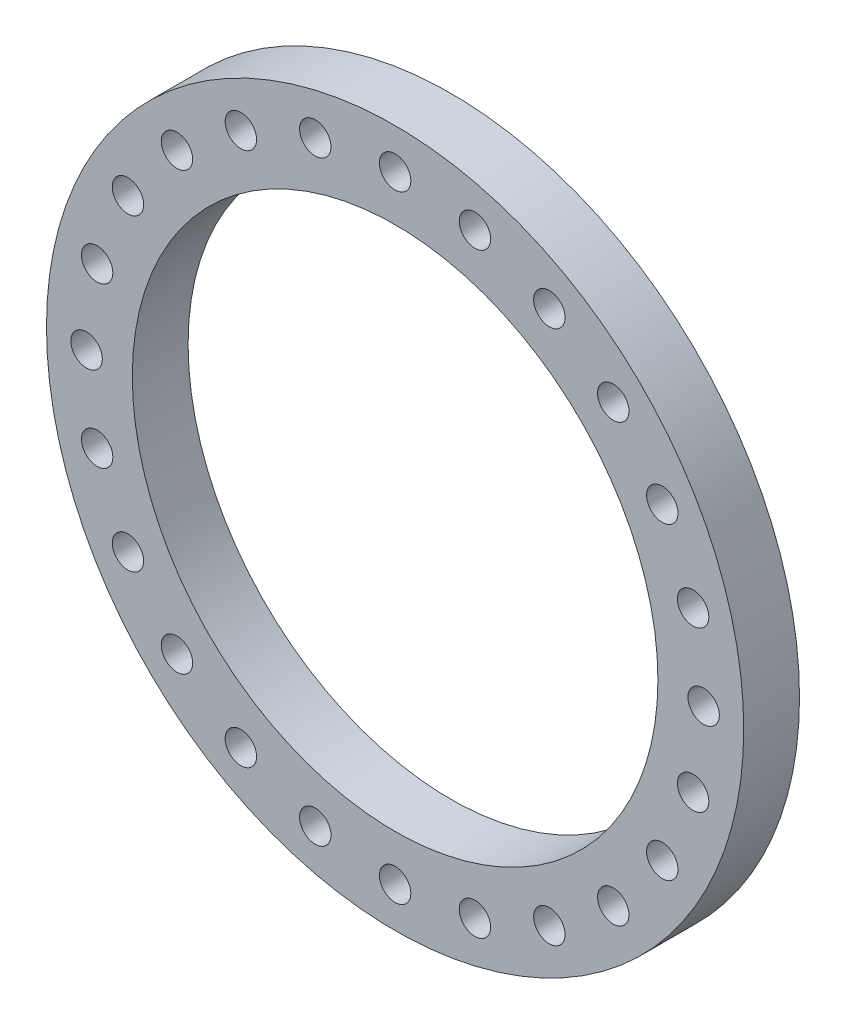
ISO-10303-21;
HEADER;
FILE_DESCRIPTION(('STEP AP214'),'2;1');
FILE_NAME('part.step','',(''),(''),'','','');
FILE_SCHEMA(('AUTOMOTIVE_DESIGN { 1 0 10303 214 1 1 1 1 }'));
ENDSEC;
DATA;
#1=APPLICATION_CONTEXT('core data for automotive mechanical design processes');
#2=APPLICATION_PROTOCOL_DEFINITION('international standard','automotive_design',2000,#1);
#3=PRODUCT_CONTEXT('',#1,'mechanical');
#4=PRODUCT('Part','Part','',(#3));
#5=PRODUCT_RELATED_PRODUCT_CATEGORY('part','',(#4));
#6=PRODUCT_DEFINITION_FORMATION('','',#4);
#7=PRODUCT_DEFINITION_CONTEXT('part definition',#1,'design');
#8=PRODUCT_DEFINITION('design','',#6,#7);
#9=PRODUCT_DEFINITION_SHAPE('','',#8);
#10=(LENGTH_UNIT() NAMED_UNIT(*) SI_UNIT(.MILLI.,.METRE.));
#11=(NAMED_UNIT(*) PLANE_ANGLE_UNIT() SI_UNIT($,.RADIAN.));
#12=(NAMED_UNIT(*) SI_UNIT($,.STERADIAN.) SOLID_ANGLE_UNIT());
#13=UNCERTAINTY_MEASURE_WITH_UNIT(LENGTH_MEASURE(1.E-05),#10,'distance_accuracy_value','');
#14=(GEOMETRIC_REPRESENTATION_CONTEXT(3) GLOBAL_UNCERTAINTY_ASSIGNED_CONTEXT((#13)) GLOBAL_UNIT_ASSIGNED_CONTEXT((#10,
#11,#12)) REPRESENTATION_CONTEXT('',''));
#15=CARTESIAN_POINT('',(0.,0.,0.));
#16=DIRECTION('',(0.,0.,1.));
#17=DIRECTION('',(1.,0.,0.));
#18=AXIS2_PLACEMENT_3D('',#15,#16,#17);
#19=CARTESIAN_POINT('',(0.,0.,62.));
#20=DIRECTION('',(0.,0.,-1.));
#21=DIRECTION('',(-1.,0.,0.));
#22=AXIS2_PLACEMENT_3D('',#19,#20,#21);
#23=CYLINDRICAL_SURFACE('',#22,387.5);
#24=CARTESIAN_POINT('',(0.,0.,62.));
#25=DIRECTION('',(0.,0.,1.));
#26=DIRECTION('',(1.,0.,0.));
#27=AXIS2_PLACEMENT_3D('',#24,#25,#26);
#28=CIRCLE('',#27,387.5);
#29=CARTESIAN_POINT('',(387.5,0.,62.));
#30=VERTEX_POINT('',#29);
#31=EDGE_CURVE('E10',#30,#30,#28,.T.);
#32=ORIENTED_EDGE('',*,*,#31,.F.);
#33=EDGE_LOOP('',(#32));
#34=FACE_BOUND('',#33,.T.);
#35=CARTESIAN_POINT('',(0.,0.,0.));
#36=DIRECTION('',(0.,0.,1.));
#37=DIRECTION('',(1.,0.,0.));
#38=AXIS2_PLACEMENT_3D('',#35,#36,#37);
#39=CIRCLE('',#38,387.5);
#40=CARTESIAN_POINT('',(387.5,0.,0.));
#41=VERTEX_POINT('',#40);
#42=EDGE_CURVE('E40',#41,#41,#39,.T.);
#43=ORIENTED_EDGE('',*,*,#42,.T.);
#44=EDGE_LOOP('',(#43));
#45=FACE_BOUND('',#44,.T.);
#46=ADVANCED_FACE('F37',(#34,#45),#23,.T.);
#47=CARTESIAN_POINT('',(0.,0.,62.));
#48=DIRECTION('',(0.,0.,1.));
#49=DIRECTION('',(1.,0.,0.));
#50=AXIS2_PLACEMENT_3D('',#47,#48,#49);
#51=PLANE('',#50);
#52=CARTESIAN_POINT('',(331.215965834522,-88.7490505656511,62.));
#53=DIRECTION('',(0.,0.,1.));
#54=DIRECTION('',(1.,0.,0.));
#55=AXIS2_PLACEMENT_3D('',#52,#53,#54);
#56=CIRCLE('',#55,17.4625);
#57=CARTESIAN_POINT('',(348.678465834522,-88.7490505656511,62.));
#58=VERTEX_POINT('',#57);
#59=EDGE_CURVE('E54',#58,#58,#56,.T.);
#60=ORIENTED_EDGE('',*,*,#59,.F.);
#61=EDGE_LOOP('',(#60));
#62=FACE_BOUND('',#61,.T.);
#63=CARTESIAN_POINT('',(296.960110957686,-171.449999999997,62.));
#64=DIRECTION('',(0.,0.,1.));
#65=DIRECTION('',(1.,0.,0.));
#66=AXIS2_PLACEMENT_3D('',#63,#64,#65);
#67=CIRCLE('',#66,17.4625);
#68=CARTESIAN_POINT('',(314.422610957686,-171.449999999997,62.));
#69=VERTEX_POINT('',#68);
#70=EDGE_CURVE('E57',#69,#69,#67,.T.);
#71=ORIENTED_EDGE('',*,*,#70,.F.);
#72=EDGE_LOOP('',(#71));
#73=FACE_BOUND('',#72,.T.);
#74=CARTESIAN_POINT('',(242.466915268869,-242.466915268865,62.));
#75=DIRECTION('',(0.,0.,1.));
#76=DIRECTION('',(1.,0.,0.));
#77=AXIS2_PLACEMENT_3D('',#74,#75,#76);
#78=CIRCLE('',#77,17.4625);
#79=CARTESIAN_POINT('',(259.929415268869,-242.466915268865,62.));
#80=VERTEX_POINT('',#79);
#81=EDGE_CURVE('E60',#80,#80,#78,.T.);
#82=ORIENTED_EDGE('',*,*,#81,.F.);
#83=EDGE_LOOP('',(#82));
#84=FACE_BOUND('',#83,.T.);
#85=CARTESIAN_POINT('',(171.450000000002,-296.960110957683,62.));
#86=DIRECTION('',(0.,0.,1.));
#87=DIRECTION('',(1.,0.,0.));
#88=AXIS2_PLACEMENT_3D('',#85,#86,#87);
#89=CIRCLE('',#88,17.4625);
#90=CARTESIAN_POINT('',(188.912500000002,-296.960110957683,62.));
#91=VERTEX_POINT('',#90);
#92=EDGE_CURVE('E63',#91,#91,#89,.T.);
#93=ORIENTED_EDGE('',*,*,#92,.F.);
#94=EDGE_LOOP('',(#93));
#95=FACE_BOUND('',#94,.T.);
#96=CARTESIAN_POINT('',(88.7490505656569,-331.215965834521,62.));
#97=DIRECTION('',(0.,0.,1.));
#98=DIRECTION('',(1.,0.,0.));
#99=AXIS2_PLACEMENT_3D('',#96,#97,#98);
#100=CIRCLE('',#99,17.4625);
#101=CARTESIAN_POINT('',(106.211550565657,-331.215965834521,62.));
#102=VERTEX_POINT('',#101);
#103=EDGE_CURVE('E66',#102,#102,#100,.T.);
#104=ORIENTED_EDGE('',*,*,#103,.F.);
#105=EDGE_LOOP('',(#104));
#106=FACE_BOUND('',#105,.T.);
#107=CARTESIAN_POINT('',(0.,-342.9,62.));
#108=DIRECTION('',(0.,0.,1.));
#109=DIRECTION('',(1.,0.,0.));
#110=AXIS2_PLACEMENT_3D('',#107,#108,#109);
#111=CIRCLE('',#110,17.4625);
#112=CARTESIAN_POINT('',(17.4625,-342.9,62.));
#113=VERTEX_POINT('',#112);
#114=EDGE_CURVE('E69',#113,#113,#111,.T.);
#115=ORIENTED_EDGE('',*,*,#114,.F.);
#116=EDGE_LOOP('',(#115));
#117=FACE_BOUND('',#116,.T.);
#118=CARTESIAN_POINT('',(-88.7490505656522,-331.215965834522,62.));
#119=DIRECTION('',(0.,0.,1.));
#120=DIRECTION('',(1.,0.,0.));
#121=AXIS2_PLACEMENT_3D('',#118,#119,#120);
#122=CIRCLE('',#121,17.4625);
#123=CARTESIAN_POINT('',(-71.2865505656522,-331.215965834522,62.));
#124=VERTEX_POINT('',#123);
#125=EDGE_CURVE('E72',#124,#124,#122,.T.);
#126=ORIENTED_EDGE('',*,*,#125,.F.);
#127=EDGE_LOOP('',(#126));
#128=FACE_BOUND('',#127,.T.);
#129=CARTESIAN_POINT('',(-171.449999999998,-296.960110957685,62.));
#130=DIRECTION('',(0.,0.,1.));
#131=DIRECTION('',(1.,0.,0.));
#132=AXIS2_PLACEMENT_3D('',#129,#130,#131);
#133=CIRCLE('',#132,17.4625);
#134=CARTESIAN_POINT('',(-153.987499999998,-296.960110957685,62.));
#135=VERTEX_POINT('',#134);
#136=EDGE_CURVE('E75',#135,#135,#133,.T.);
#137=ORIENTED_EDGE('',*,*,#136,.F.);
#138=EDGE_LOOP('',(#137));
#139=FACE_BOUND('',#138,.T.);
#140=CARTESIAN_POINT('',(-242.466915268866,-242.466915268868,62.));
#141=DIRECTION('',(0.,0.,1.));
#142=DIRECTION('',(1.,0.,0.));
#143=AXIS2_PLACEMENT_3D('',#140,#141,#142);
#144=CIRCLE('',#143,17.4625);
#145=CARTESIAN_POINT('',(-225.004415268866,-242.466915268868,62.));
#146=VERTEX_POINT('',#145);
#147=EDGE_CURVE('E78',#146,#146,#144,.T.);
#148=ORIENTED_EDGE('',*,*,#147,.F.);
#149=EDGE_LOOP('',(#148));
#150=FACE_BOUND('',#149,.T.);
#151=CARTESIAN_POINT('',(-296.960110957683,-171.450000000001,62.));
#152=DIRECTION('',(0.,0.,1.));
#153=DIRECTION('',(1.,0.,0.));
#154=AXIS2_PLACEMENT_3D('',#151,#152,#153);
#155=CIRCLE('',#154,17.4625);
#156=CARTESIAN_POINT('',(-279.497610957683,-171.450000000001,62.));
#157=VERTEX_POINT('',#156);
#158=EDGE_CURVE('E81',#157,#157,#155,.T.);
#159=ORIENTED_EDGE('',*,*,#158,.F.);
#160=EDGE_LOOP('',(#159));
#161=FACE_BOUND('',#160,.T.);
#162=CARTESIAN_POINT('',(-331.215965834521,-88.7490505656557,62.));
#163=DIRECTION('',(0.,0.,1.));
#164=DIRECTION('',(1.,0.,0.));
#165=AXIS2_PLACEMENT_3D('',#162,#163,#164);
#166=CIRCLE('',#165,17.4625);
#167=CARTESIAN_POINT('',(-313.753465834521,-88.7490505656557,62.));
#168=VERTEX_POINT('',#167);
#169=EDGE_CURVE('E84',#168,#168,#166,.T.);
#170=ORIENTED_EDGE('',*,*,#169,.F.);
#171=EDGE_LOOP('',(#170));
#172=FACE_BOUND('',#171,.T.);
#173=CARTESIAN_POINT('',(-342.9,-1.19722895108931E-12,62.));
#174=DIRECTION('',(0.,0.,1.));
#175=DIRECTION('',(1.,0.,0.));
#176=AXIS2_PLACEMENT_3D('',#173,#174,#175);
#177=CIRCLE('',#176,17.4625);
#178=CARTESIAN_POINT('',(-325.4375,-1.19722895108931E-12,62.));
#179=VERTEX_POINT('',#178);
#180=EDGE_CURVE('E87',#179,#179,#177,.T.);
#181=ORIENTED_EDGE('',*,*,#180,.F.);
#182=EDGE_LOOP('',(#181));
#183=FACE_BOUND('',#182,.T.);
#184=CARTESIAN_POINT('',(-331.215965834522,88.7490505656534,62.));
#185=DIRECTION('',(0.,0.,1.));
#186=DIRECTION('',(1.,0.,0.));
#187=AXIS2_PLACEMENT_3D('',#184,#185,#186);
#188=CIRCLE('',#187,17.4625);
#189=CARTESIAN_POINT('',(-313.753465834522,88.7490505656534,62.));
#190=VERTEX_POINT('',#189);
#191=EDGE_CURVE('E90',#190,#190,#188,.T.);
#192=ORIENTED_EDGE('',*,*,#191,.F.);
#193=EDGE_LOOP('',(#192));
#194=FACE_BOUND('',#193,.T.);
#195=CARTESIAN_POINT('',(-296.960110957684,171.449999999999,62.));
#196=DIRECTION('',(0.,0.,1.));
#197=DIRECTION('',(1.,0.,0.));
#198=AXIS2_PLACEMENT_3D('',#195,#196,#197);
#199=CIRCLE('',#198,17.4625);
#200=CARTESIAN_POINT('',(-279.497610957684,171.449999999999,62.));
#201=VERTEX_POINT('',#200);
#202=EDGE_CURVE('E93',#201,#201,#199,.T.);
#203=ORIENTED_EDGE('',*,*,#202,.F.);
#204=EDGE_LOOP('',(#203));
#205=FACE_BOUND('',#204,.T.);
#206=CARTESIAN_POINT('',(-242.466915268868,242.466915268867,62.));
#207=DIRECTION('',(0.,0.,1.));
#208=DIRECTION('',(1.,0.,0.));
#209=AXIS2_PLACEMENT_3D('',#206,#207,#208);
#210=CIRCLE('',#209,17.4625);
#211=CARTESIAN_POINT('',(-225.004415268868,242.466915268867,62.));
#212=VERTEX_POINT('',#211);
#213=EDGE_CURVE('E96',#212,#212,#210,.T.);
#214=ORIENTED_EDGE('',*,*,#213,.F.);
#215=EDGE_LOOP('',(#214));
#216=FACE_BOUND('',#215,.T.);
#217=CARTESIAN_POINT('',(-171.45,296.960110957684,62.));
#218=DIRECTION('',(0.,0.,1.));
#219=DIRECTION('',(1.,0.,0.));
#220=AXIS2_PLACEMENT_3D('',#217,#218,#219);
#221=CIRCLE('',#220,17.4625);
#222=CARTESIAN_POINT('',(-153.9875,296.960110957684,62.));
#223=VERTEX_POINT('',#222);
#224=EDGE_CURVE('E99',#223,#223,#221,.T.);
#225=ORIENTED_EDGE('',*,*,#224,.F.);
#226=EDGE_LOOP('',(#225));
#227=FACE_BOUND('',#226,.T.);
#228=CARTESIAN_POINT('',(342.9,3.59168685326793E-12,62.));
#229=DIRECTION('',(0.,0.,1.));
#230=DIRECTION('',(1.,0.,0.));
#231=AXIS2_PLACEMENT_3D('',#228,#229,#230);
#232=CIRCLE('',#231,17.4625);
#233=CARTESIAN_POINT('',(360.3625,3.59168685326793E-12,62.));
#234=VERTEX_POINT('',#233);
#235=EDGE_CURVE('E102',#234,#234,#232,.T.);
#236=ORIENTED_EDGE('',*,*,#235,.F.);
#237=EDGE_LOOP('',(#236));
#238=FACE_BOUND('',#237,.T.);
#239=CARTESIAN_POINT('',(331.21596583452,88.749050565658,62.));
#240=DIRECTION('',(0.,0.,1.));
#241=DIRECTION('',(1.,0.,0.));
#242=AXIS2_PLACEMENT_3D('',#239,#240,#241);
#243=CIRCLE('',#242,17.4625);
#244=CARTESIAN_POINT('',(348.678465834521,88.749050565658,62.));
#245=VERTEX_POINT('',#244);
#246=EDGE_CURVE('E105',#245,#245,#243,.T.);
#247=ORIENTED_EDGE('',*,*,#246,.F.);
#248=EDGE_LOOP('',(#247));
#249=FACE_BOUND('',#248,.T.);
#250=CARTESIAN_POINT('',(296.960110957682,171.450000000003,62.));
#251=DIRECTION('',(0.,0.,1.));
#252=DIRECTION('',(1.,0.,0.));
#253=AXIS2_PLACEMENT_3D('',#250,#251,#252);
#254=CIRCLE('',#253,17.4625);
#255=CARTESIAN_POINT('',(314.422610957682,171.450000000003,62.));
#256=VERTEX_POINT('',#255);
#257=EDGE_CURVE('E108',#256,#256,#254,.T.);
#258=ORIENTED_EDGE('',*,*,#257,.F.);
#259=EDGE_LOOP('',(#258));
#260=FACE_BOUND('',#259,.T.);
#261=CARTESIAN_POINT('',(242.466915268864,242.46691526887,62.));
#262=DIRECTION('',(0.,0.,1.));
#263=DIRECTION('',(1.,0.,0.));
#264=AXIS2_PLACEMENT_3D('',#261,#262,#263);
#265=CIRCLE('',#264,17.4625);
#266=CARTESIAN_POINT('',(259.929415268864,242.46691526887,62.));
#267=VERTEX_POINT('',#266);
#268=EDGE_CURVE('E111',#267,#267,#265,.T.);
#269=ORIENTED_EDGE('',*,*,#268,.F.);
#270=EDGE_LOOP('',(#269));
#271=FACE_BOUND('',#270,.T.);
#272=CARTESIAN_POINT('',(171.449999999996,296.960110957686,62.));
#273=DIRECTION('',(0.,0.,1.));
#274=DIRECTION('',(1.,0.,0.));
#275=AXIS2_PLACEMENT_3D('',#272,#273,#274);
#276=CIRCLE('',#275,17.4625);
#277=CARTESIAN_POINT('',(188.912499999996,296.960110957686,62.));
#278=VERTEX_POINT('',#277);
#279=EDGE_CURVE('E114',#278,#278,#276,.T.);
#280=ORIENTED_EDGE('',*,*,#279,.F.);
#281=EDGE_LOOP('',(#280));
#282=FACE_BOUND('',#281,.T.);
#283=CARTESIAN_POINT('',(88.7490505656499,331.215965834523,62.));
#284=DIRECTION('',(0.,0.,1.));
#285=DIRECTION('',(1.,0.,0.));
#286=AXIS2_PLACEMENT_3D('',#283,#284,#285);
#287=CIRCLE('',#286,17.4625);
#288=CARTESIAN_POINT('',(106.21155056565,331.215965834523,62.));
#289=VERTEX_POINT('',#288);
#290=EDGE_CURVE('E117',#289,#289,#287,.T.);
#291=ORIENTED_EDGE('',*,*,#290,.F.);
#292=EDGE_LOOP('',(#291));
#293=FACE_BOUND('',#292,.T.);
#294=CARTESIAN_POINT('',(-88.7490505656546,331.215965834521,62.));
#295=DIRECTION('',(0.,0.,1.));
#296=DIRECTION('',(1.,0.,0.));
#297=AXIS2_PLACEMENT_3D('',#294,#295,#296);
#298=CIRCLE('',#297,17.4625);
#299=CARTESIAN_POINT('',(-71.2865505656546,331.215965834521,62.));
#300=VERTEX_POINT('',#299);
#301=EDGE_CURVE('E120',#300,#300,#298,.T.);
#302=ORIENTED_EDGE('',*,*,#301,.F.);
#303=EDGE_LOOP('',(#302));
#304=FACE_BOUND('',#303,.T.);
#305=CARTESIAN_POINT('',(0.,0.,62.));
#306=DIRECTION('',(0.,0.,1.));
#307=DIRECTION('',(1.,0.,0.));
#308=AXIS2_PLACEMENT_3D('',#305,#306,#307);
#309=CIRCLE('',#308,292.1);
#310=CARTESIAN_POINT('',(292.1,0.,62.));
#311=VERTEX_POINT('',#310);
#312=EDGE_CURVE('E179',#311,#311,#309,.T.);
#313=ORIENTED_EDGE('',*,*,#312,.F.);
#314=EDGE_LOOP('',(#313));
#315=FACE_BOUND('',#314,.T.);
#316=CARTESIAN_POINT('',(0.,342.9,62.));
#317=DIRECTION('',(0.,0.,1.));
#318=DIRECTION('',(1.,0.,0.));
#319=AXIS2_PLACEMENT_3D('',#316,#317,#318);
#320=CIRCLE('',#319,17.4625);
#321=CARTESIAN_POINT('',(17.4625,342.9,62.));
#322=VERTEX_POINT('',#321);
#323=EDGE_CURVE('E47',#322,#322,#320,.T.);
#324=ORIENTED_EDGE('',*,*,#323,.F.);
#325=EDGE_LOOP('',(#324));
#326=FACE_BOUND('',#325,.T.);
#327=ORIENTED_EDGE('',*,*,#31,.T.);
#328=EDGE_LOOP('',(#327));
#329=FACE_BOUND('',#328,.T.);
#330=ADVANCED_FACE('F215',(#62,#73,#84,#95,#106,#117,#128,#139,#150,#161,#172,#183,#194,#205,
#216,#227,#238,#249,#260,#271,#282,#293,#304,#315,#326,#329),#51,.T.);
#331=CARTESIAN_POINT('',(0.,0.,0.));
#332=DIRECTION('',(0.,0.,1.));
#333=DIRECTION('',(1.,0.,0.));
#334=AXIS2_PLACEMENT_3D('',#331,#332,#333);
#335=PLANE('',#334);
#336=CARTESIAN_POINT('',(0.,0.,0.));
#337=DIRECTION('',(0.,0.,1.));
#338=DIRECTION('',(1.,0.,0.));
#339=AXIS2_PLACEMENT_3D('',#336,#337,#338);
#340=CIRCLE('',#339,292.1);
#341=CARTESIAN_POINT('',(292.1,0.,0.));
#342=VERTEX_POINT('',#341);
#343=EDGE_CURVE('E195',#342,#342,#340,.T.);
#344=ORIENTED_EDGE('',*,*,#343,.T.);
#345=EDGE_LOOP('',(#344));
#346=FACE_BOUND('',#345,.T.);
#347=CARTESIAN_POINT('',(331.215965834522,-88.7490505656511,0.));
#348=DIRECTION('',(0.,0.,1.));
#349=DIRECTION('',(-0.258819045102511,-0.965925826289071,0.));
#350=AXIS2_PLACEMENT_3D('',#347,#348,#349);
#351=CIRCLE('',#350,17.4625);
#352=CARTESIAN_POINT('',(326.69633825942,-105.616530307224,0.));
#353=VERTEX_POINT('',#352);
#354=EDGE_CURVE('E151',#353,#353,#351,.T.);
#355=ORIENTED_EDGE('',*,*,#354,.T.);
#356=EDGE_LOOP('',(#355));
#357=FACE_BOUND('',#356,.T.);
#358=CARTESIAN_POINT('',(296.960110957686,-171.449999999997,0.));
#359=DIRECTION('',(0.,0.,1.));
#360=DIRECTION('',(-0.499999999999992,-0.866025403784443,0.));
#361=AXIS2_PLACEMENT_3D('',#358,#359,#360);
#362=CIRCLE('',#361,17.4625);
#363=CARTESIAN_POINT('',(288.228860957686,-186.572968613583,0.));
#364=VERTEX_POINT('',#363);
#365=EDGE_CURVE('E154',#364,#364,#362,.T.);
#366=ORIENTED_EDGE('',*,*,#365,.T.);
#367=EDGE_LOOP('',(#366));
#368=FACE_BOUND('',#367,.T.);
#369=CARTESIAN_POINT('',(242.466915268869,-242.466915268865,0.));
#370=DIRECTION('',(0.,0.,1.));
#371=DIRECTION('',(-0.707106781186541,-0.707106781186554,0.));
#372=AXIS2_PLACEMENT_3D('',#369,#370,#371);
#373=CIRCLE('',#372,17.4625);
#374=CARTESIAN_POINT('',(230.119063102399,-254.814767435335,0.));
#375=VERTEX_POINT('',#374);
#376=EDGE_CURVE('E158',#375,#375,#373,.T.);
#377=ORIENTED_EDGE('',*,*,#376,.T.);
#378=EDGE_LOOP('',(#377));
#379=FACE_BOUND('',#378,.T.);
#380=CARTESIAN_POINT('',(171.450000000002,-296.960110957683,0.));
#381=DIRECTION('',(0.,0.,1.));
#382=DIRECTION('',(-0.866025403784435,-0.500000000000007,0.));
#383=AXIS2_PLACEMENT_3D('',#380,#381,#382);
#384=CIRCLE('',#383,17.4625);
#385=CARTESIAN_POINT('',(156.327031386417,-305.691360957683,0.));
#386=VERTEX_POINT('',#385);
#387=EDGE_CURVE('E161',#386,#386,#384,.T.);
#388=ORIENTED_EDGE('',*,*,#387,.T.);
#389=EDGE_LOOP('',(#388));
#390=FACE_BOUND('',#389,.T.);
#391=CARTESIAN_POINT('',(88.7490505656569,-331.215965834521,0.));
#392=DIRECTION('',(0.,0.,1.));
#393=DIRECTION('',(-0.965925826289066,-0.258819045102528,0.));
#394=AXIS2_PLACEMENT_3D('',#391,#392,#393);
#395=CIRCLE('',#394,17.4625);
#396=CARTESIAN_POINT('',(71.8815708240841,-335.735593409624,0.));
#397=VERTEX_POINT('',#396);
#398=EDGE_CURVE('E164',#397,#397,#395,.T.);
#399=ORIENTED_EDGE('',*,*,#398,.T.);
#400=EDGE_LOOP('',(#399));
#401=FACE_BOUND('',#400,.T.);
#402=CARTESIAN_POINT('',(0.,-342.9,0.));
#403=DIRECTION('',(0.,0.,1.));
#404=DIRECTION('',(-1.,0.,0.));
#405=AXIS2_PLACEMENT_3D('',#402,#403,#404);
#406=CIRCLE('',#405,17.4625);
#407=CARTESIAN_POINT('',(-17.4625,-342.9,0.));
#408=VERTEX_POINT('',#407);
#409=EDGE_CURVE('E167',#408,#408,#406,.T.);
#410=ORIENTED_EDGE('',*,*,#409,.T.);
#411=EDGE_LOOP('',(#410));
#412=FACE_BOUND('',#411,.T.);
#413=CARTESIAN_POINT('',(-88.7490505656522,-331.215965834522,0.));
#414=DIRECTION('',(0.,0.,1.));
#415=DIRECTION('',(-0.96592582628907,0.258819045102515,0.));
#416=AXIS2_PLACEMENT_3D('',#413,#414,#415);
#417=CIRCLE('',#416,17.4625);
#418=CARTESIAN_POINT('',(-105.616530307225,-326.696338259419,0.));
#419=VERTEX_POINT('',#418);
#420=EDGE_CURVE('E170',#419,#419,#417,.T.);
#421=ORIENTED_EDGE('',*,*,#420,.T.);
#422=EDGE_LOOP('',(#421));
#423=FACE_BOUND('',#422,.T.);
#424=CARTESIAN_POINT('',(-171.449999999998,-296.960110957685,0.));
#425=DIRECTION('',(0.,0.,1.));
#426=DIRECTION('',(-0.866025403784442,0.499999999999995,0.));
#427=AXIS2_PLACEMENT_3D('',#424,#425,#426);
#428=CIRCLE('',#427,17.4625);
#429=CARTESIAN_POINT('',(-186.572968613584,-288.228860957685,0.));
#430=VERTEX_POINT('',#429);
#431=EDGE_CURVE('E131',#430,#430,#428,.T.);
#432=ORIENTED_EDGE('',*,*,#431,.T.);
#433=EDGE_LOOP('',(#432));
#434=FACE_BOUND('',#433,.T.);
#435=CARTESIAN_POINT('',(-242.466915268866,-242.466915268868,0.));
#436=DIRECTION('',(0.,0.,1.));
#437=DIRECTION('',(-0.707106781186551,0.707106781186544,0.));
#438=AXIS2_PLACEMENT_3D('',#435,#436,#437);
#439=CIRCLE('',#438,17.4625);
#440=CARTESIAN_POINT('',(-254.814767435336,-230.119063102398,0.));
#441=VERTEX_POINT('',#440);
#442=EDGE_CURVE('E127',#441,#441,#439,.T.);
#443=ORIENTED_EDGE('',*,*,#442,.T.);
#444=EDGE_LOOP('',(#443));
#445=FACE_BOUND('',#444,.T.);
#446=CARTESIAN_POINT('',(-296.960110957683,-171.450000000001,0.));
#447=DIRECTION('',(0.,0.,1.));
#448=DIRECTION('',(-0.500000000000004,0.866025403784436,0.));
#449=AXIS2_PLACEMENT_3D('',#446,#447,#448);
#450=CIRCLE('',#449,17.4625);
#451=CARTESIAN_POINT('',(-305.691360957683,-156.327031386416,0.));
#452=VERTEX_POINT('',#451);
#453=EDGE_CURVE('E130',#452,#452,#450,.T.);
#454=ORIENTED_EDGE('',*,*,#453,.T.);
#455=EDGE_LOOP('',(#454));
#456=FACE_BOUND('',#455,.T.);
#457=CARTESIAN_POINT('',(-331.215965834521,-88.7490505656557,0.));
#458=DIRECTION('',(0.,0.,1.));
#459=DIRECTION('',(-0.258819045102525,0.965925826289067,0.));
#460=AXIS2_PLACEMENT_3D('',#457,#458,#459);
#461=CIRCLE('',#460,17.4625);
#462=CARTESIAN_POINT('',(-335.735593409624,-71.8815708240829,0.));
#463=VERTEX_POINT('',#462);
#464=EDGE_CURVE('E134',#463,#463,#461,.T.);
#465=ORIENTED_EDGE('',*,*,#464,.T.);
#466=EDGE_LOOP('',(#465));
#467=FACE_BOUND('',#466,.T.);
#468=CARTESIAN_POINT('',(-342.9,-1.19722895108931E-12,0.));
#469=DIRECTION('',(0.,0.,1.));
#470=DIRECTION('',(0.,1.,0.));
#471=AXIS2_PLACEMENT_3D('',#468,#469,#470);
#472=CIRCLE('',#471,17.4625);
#473=CARTESIAN_POINT('',(-342.9,17.4624999999988,0.));
#474=VERTEX_POINT('',#473);
#475=EDGE_CURVE('E137',#474,#474,#472,.T.);
#476=ORIENTED_EDGE('',*,*,#475,.T.);
#477=EDGE_LOOP('',(#476));
#478=FACE_BOUND('',#477,.T.);
#479=CARTESIAN_POINT('',(-331.215965834522,88.7490505656534,0.));
#480=DIRECTION('',(0.,0.,1.));
#481=DIRECTION('',(0.258819045102518,0.965925826289069,0.));
#482=AXIS2_PLACEMENT_3D('',#479,#480,#481);
#483=CIRCLE('',#482,17.4625);
#484=CARTESIAN_POINT('',(-326.696338259419,105.616530307226,0.));
#485=VERTEX_POINT('',#484);
#486=EDGE_CURVE('E140',#485,#485,#483,.T.);
#487=ORIENTED_EDGE('',*,*,#486,.T.);
#488=EDGE_LOOP('',(#487));
#489=FACE_BOUND('',#488,.T.);
#490=CARTESIAN_POINT('',(-296.960110957684,171.449999999999,0.));
#491=DIRECTION('',(0.,0.,1.));
#492=DIRECTION('',(0.499999999999998,0.86602540378444,0.));
#493=AXIS2_PLACEMENT_3D('',#490,#491,#492);
#494=CIRCLE('',#493,17.4625);
#495=CARTESIAN_POINT('',(-288.228860957684,186.572968613585,0.));
#496=VERTEX_POINT('',#495);
#497=EDGE_CURVE('E143',#496,#496,#494,.T.);
#498=ORIENTED_EDGE('',*,*,#497,.T.);
#499=EDGE_LOOP('',(#498));
#500=FACE_BOUND('',#499,.T.);
#501=CARTESIAN_POINT('',(-242.466915268868,242.466915268867,0.));
#502=DIRECTION('',(0.,0.,1.));
#503=DIRECTION('',(0.707106781186546,0.707106781186549,0.));
#504=AXIS2_PLACEMENT_3D('',#501,#502,#503);
#505=CIRCLE('',#504,17.4625);
#506=CARTESIAN_POINT('',(-230.119063102398,254.814767435337,0.));
#507=VERTEX_POINT('',#506);
#508=EDGE_CURVE('E146',#507,#507,#505,.T.);
#509=ORIENTED_EDGE('',*,*,#508,.T.);
#510=EDGE_LOOP('',(#509));
#511=FACE_BOUND('',#510,.T.);
#512=CARTESIAN_POINT('',(-171.45,296.960110957684,0.));
#513=DIRECTION('',(0.,0.,1.));
#514=DIRECTION('',(0.866025403784438,0.500000000000001,0.));
#515=AXIS2_PLACEMENT_3D('',#512,#513,#514);
#516=CIRCLE('',#515,17.4625);
#517=CARTESIAN_POINT('',(-156.327031386415,305.691360957684,0.));
#518=VERTEX_POINT('',#517);
#519=EDGE_CURVE('E126',#518,#518,#516,.T.);
#520=ORIENTED_EDGE('',*,*,#519,.T.);
#521=EDGE_LOOP('',(#520));
#522=FACE_BOUND('',#521,.T.);
#523=CARTESIAN_POINT('',(342.9,3.59168685326793E-12,0.));
#524=DIRECTION('',(0.,0.,1.));
#525=DIRECTION('',(0.,-1.,0.));
#526=AXIS2_PLACEMENT_3D('',#523,#524,#525);
#527=CIRCLE('',#526,17.4625);
#528=CARTESIAN_POINT('',(342.9,-17.4624999999964,0.));
#529=VERTEX_POINT('',#528);
#530=EDGE_CURVE('E155',#529,#529,#527,.T.);
#531=ORIENTED_EDGE('',*,*,#530,.T.);
#532=EDGE_LOOP('',(#531));
#533=FACE_BOUND('',#532,.T.);
#534=CARTESIAN_POINT('',(331.21596583452,88.749050565658,0.));
#535=DIRECTION('',(0.,0.,1.));
#536=DIRECTION('',(0.258819045102531,-0.965925826289065,0.));
#537=AXIS2_PLACEMENT_3D('',#534,#535,#536);
#538=CIRCLE('',#537,17.4625);
#539=CARTESIAN_POINT('',(335.735593409623,71.8815708240852,0.));
#540=VERTEX_POINT('',#539);
#541=EDGE_CURVE('E188',#540,#540,#538,.T.);
#542=ORIENTED_EDGE('',*,*,#541,.T.);
#543=EDGE_LOOP('',(#542));
#544=FACE_BOUND('',#543,.T.);
#545=CARTESIAN_POINT('',(296.960110957682,171.450000000003,0.));
#546=DIRECTION('',(0.,0.,1.));
#547=DIRECTION('',(0.50000000000001,-0.866025403784433,0.));
#548=AXIS2_PLACEMENT_3D('',#545,#546,#547);
#549=CIRCLE('',#548,17.4625);
#550=CARTESIAN_POINT('',(305.691360957682,156.327031386418,0.));
#551=VERTEX_POINT('',#550);
#552=EDGE_CURVE('E185',#551,#551,#549,.T.);
#553=ORIENTED_EDGE('',*,*,#552,.T.);
#554=EDGE_LOOP('',(#553));
#555=FACE_BOUND('',#554,.T.);
#556=CARTESIAN_POINT('',(242.466915268864,242.46691526887,0.));
#557=DIRECTION('',(0.,0.,1.));
#558=DIRECTION('',(0.707106781186556,-0.707106781186539,0.));
#559=AXIS2_PLACEMENT_3D('',#556,#557,#558);
#560=CIRCLE('',#559,17.4625);
#561=CARTESIAN_POINT('',(254.814767435334,230.1190631024,0.));
#562=VERTEX_POINT('',#561);
#563=EDGE_CURVE('E182',#562,#562,#560,.T.);
#564=ORIENTED_EDGE('',*,*,#563,.T.);
#565=EDGE_LOOP('',(#564));
#566=FACE_BOUND('',#565,.T.);
#567=CARTESIAN_POINT('',(171.449999999996,296.960110957686,0.));
#568=DIRECTION('',(0.,0.,1.));
#569=DIRECTION('',(0.866025403784445,-0.499999999999989,0.));
#570=AXIS2_PLACEMENT_3D('',#567,#568,#569);
#571=CIRCLE('',#570,17.4625);
#572=CARTESIAN_POINT('',(186.572968613582,288.228860957686,0.));
#573=VERTEX_POINT('',#572);
#574=EDGE_CURVE('E178',#573,#573,#571,.T.);
#575=ORIENTED_EDGE('',*,*,#574,.T.);
#576=EDGE_LOOP('',(#575));
#577=FACE_BOUND('',#576,.T.);
#578=CARTESIAN_POINT('',(88.7490505656499,331.215965834523,0.));
#579=DIRECTION('',(0.,0.,1.));
#580=DIRECTION('',(0.965925826289072,-0.258819045102508,0.));
#581=AXIS2_PLACEMENT_3D('',#578,#579,#580);
#582=CIRCLE('',#581,17.4625);
#583=CARTESIAN_POINT('',(105.616530307223,326.69633825942,0.));
#584=VERTEX_POINT('',#583);
#585=EDGE_CURVE('E175',#584,#584,#582,.T.);
#586=ORIENTED_EDGE('',*,*,#585,.T.);
#587=EDGE_LOOP('',(#586));
#588=FACE_BOUND('',#587,.T.);
#589=CARTESIAN_POINT('',(-88.7490505656546,331.215965834521,0.));
#590=DIRECTION('',(0.,0.,1.));
#591=DIRECTION('',(0.965925826289068,0.258819045102521,0.));
#592=AXIS2_PLACEMENT_3D('',#589,#590,#591);
#593=CIRCLE('',#592,17.4625);
#594=CARTESIAN_POINT('',(-71.8815708240817,335.735593409624,0.));
#595=VERTEX_POINT('',#594);
#596=EDGE_CURVE('E123',#595,#595,#593,.T.);
#597=ORIENTED_EDGE('',*,*,#596,.T.);
#598=EDGE_LOOP('',(#597));
#599=FACE_BOUND('',#598,.T.);
#600=CARTESIAN_POINT('',(0.,342.9,0.));
#601=DIRECTION('',(0.,0.,1.));
#602=DIRECTION('',(1.,0.,0.));
#603=AXIS2_PLACEMENT_3D('',#600,#601,#602);
#604=CIRCLE('',#603,17.4625);
#605=CARTESIAN_POINT('',(17.4625,342.9,0.));
#606=VERTEX_POINT('',#605);
#607=EDGE_CURVE('E51',#606,#606,#604,.T.);
#608=ORIENTED_EDGE('',*,*,#607,.T.);
#609=EDGE_LOOP('',(#608));
#610=FACE_BOUND('',#609,.T.);
#611=ORIENTED_EDGE('',*,*,#42,.F.);
#612=EDGE_LOOP('',(#611));
#613=FACE_BOUND('',#612,.T.);
#614=ADVANCED_FACE('F199',(#346,#357,#368,#379,#390,#401,#412,#423,#434,#445,#456,#467,#478,
#489,#500,#511,#522,#533,#544,#555,#566,#577,#588,#599,#610,#613),#335,.F.);
#615=CARTESIAN_POINT('',(0.,342.9,0.));
#616=DIRECTION('',(0.,0.,1.));
#617=DIRECTION('',(1.,0.,0.));
#618=AXIS2_PLACEMENT_3D('',#615,#616,#617);
#619=CYLINDRICAL_SURFACE('',#618,17.4625);
#620=ORIENTED_EDGE('',*,*,#323,.T.);
#621=EDGE_LOOP('',(#620));
#622=FACE_BOUND('',#621,.T.);
#623=ORIENTED_EDGE('',*,*,#607,.F.);
#624=EDGE_LOOP('',(#623));
#625=FACE_BOUND('',#624,.T.);
#626=ADVANCED_FACE('F226',(#622,#625),#619,.F.);
#627=CARTESIAN_POINT('',(-88.7490505656546,331.215965834521,0.));
#628=DIRECTION('',(0.,0.,1.));
#629=DIRECTION('',(1.,0.,0.));
#630=AXIS2_PLACEMENT_3D('',#627,#628,#629);
#631=CYLINDRICAL_SURFACE('',#630,17.4625);
#632=ORIENTED_EDGE('',*,*,#301,.T.);
#633=EDGE_LOOP('',(#632));
#634=FACE_BOUND('',#633,.T.);
#635=ORIENTED_EDGE('',*,*,#596,.F.);
#636=EDGE_LOOP('',(#635));
#637=FACE_BOUND('',#636,.T.);
#638=ADVANCED_FACE('F230',(#634,#637),#631,.F.);
#639=CARTESIAN_POINT('',(88.7490505656499,331.215965834523,0.));
#640=DIRECTION('',(0.,0.,1.));
#641=DIRECTION('',(1.,0.,0.));
#642=AXIS2_PLACEMENT_3D('',#639,#640,#641);
#643=CYLINDRICAL_SURFACE('',#642,17.4625);
#644=ORIENTED_EDGE('',*,*,#290,.T.);
#645=EDGE_LOOP('',(#644));
#646=FACE_BOUND('',#645,.T.);
#647=ORIENTED_EDGE('',*,*,#585,.F.);
#648=EDGE_LOOP('',(#647));
#649=FACE_BOUND('',#648,.T.);
#650=ADVANCED_FACE('F236',(#646,#649),#643,.F.);
#651=CARTESIAN_POINT('',(171.449999999996,296.960110957686,0.));
#652=DIRECTION('',(0.,0.,1.));
#653=DIRECTION('',(1.,0.,0.));
#654=AXIS2_PLACEMENT_3D('',#651,#652,#653);
#655=CYLINDRICAL_SURFACE('',#654,17.4625);
#656=ORIENTED_EDGE('',*,*,#279,.T.);
#657=EDGE_LOOP('',(#656));
#658=FACE_BOUND('',#657,.T.);
#659=ORIENTED_EDGE('',*,*,#574,.F.);
#660=EDGE_LOOP('',(#659));
#661=FACE_BOUND('',#660,.T.);
#662=ADVANCED_FACE('F300',(#658,#661),#655,.F.);
#663=CARTESIAN_POINT('',(242.466915268864,242.46691526887,0.));
#664=DIRECTION('',(0.,0.,1.));
#665=DIRECTION('',(1.,0.,0.));
#666=AXIS2_PLACEMENT_3D('',#663,#664,#665);
#667=CYLINDRICAL_SURFACE('',#666,17.4625);
#668=ORIENTED_EDGE('',*,*,#268,.T.);
#669=EDGE_LOOP('',(#668));
#670=FACE_BOUND('',#669,.T.);
#671=ORIENTED_EDGE('',*,*,#563,.F.);
#672=EDGE_LOOP('',(#671));
#673=FACE_BOUND('',#672,.T.);
#674=ADVANCED_FACE('F304',(#670,#673),#667,.F.);
#675=CARTESIAN_POINT('',(296.960110957682,171.450000000003,0.));
#676=DIRECTION('',(0.,0.,1.));
#677=DIRECTION('',(1.,0.,0.));
#678=AXIS2_PLACEMENT_3D('',#675,#676,#677);
#679=CYLINDRICAL_SURFACE('',#678,17.4625);
#680=ORIENTED_EDGE('',*,*,#257,.T.);
#681=EDGE_LOOP('',(#680));
#682=FACE_BOUND('',#681,.T.);
#683=ORIENTED_EDGE('',*,*,#552,.F.);
#684=EDGE_LOOP('',(#683));
#685=FACE_BOUND('',#684,.T.);
#686=ADVANCED_FACE('F308',(#682,#685),#679,.F.);
#687=CARTESIAN_POINT('',(331.21596583452,88.749050565658,0.));
#688=DIRECTION('',(0.,0.,1.));
#689=DIRECTION('',(1.,0.,0.));
#690=AXIS2_PLACEMENT_3D('',#687,#688,#689);
#691=CYLINDRICAL_SURFACE('',#690,17.4625);
#692=ORIENTED_EDGE('',*,*,#246,.T.);
#693=EDGE_LOOP('',(#692));
#694=FACE_BOUND('',#693,.T.);
#695=ORIENTED_EDGE('',*,*,#541,.F.);
#696=EDGE_LOOP('',(#695));
#697=FACE_BOUND('',#696,.T.);
#698=ADVANCED_FACE('F312',(#694,#697),#691,.F.);
#699=CARTESIAN_POINT('',(342.9,3.59168685326793E-12,0.));
#700=DIRECTION('',(0.,0.,1.));
#701=DIRECTION('',(1.,0.,0.));
#702=AXIS2_PLACEMENT_3D('',#699,#700,#701);
#703=CYLINDRICAL_SURFACE('',#702,17.4625);
#704=ORIENTED_EDGE('',*,*,#235,.T.);
#705=EDGE_LOOP('',(#704));
#706=FACE_BOUND('',#705,.T.);
#707=ORIENTED_EDGE('',*,*,#530,.F.);
#708=EDGE_LOOP('',(#707));
#709=FACE_BOUND('',#708,.T.);
#710=ADVANCED_FACE('F269',(#706,#709),#703,.F.);
#711=CARTESIAN_POINT('',(-171.45,296.960110957684,0.));
#712=DIRECTION('',(0.,0.,1.));
#713=DIRECTION('',(1.,0.,0.));
#714=AXIS2_PLACEMENT_3D('',#711,#712,#713);
#715=CYLINDRICAL_SURFACE('',#714,17.4625);
#716=ORIENTED_EDGE('',*,*,#224,.T.);
#717=EDGE_LOOP('',(#716));
#718=FACE_BOUND('',#717,.T.);
#719=ORIENTED_EDGE('',*,*,#519,.F.);
#720=EDGE_LOOP('',(#719));
#721=FACE_BOUND('',#720,.T.);
#722=ADVANCED_FACE('F266',(#718,#721),#715,.F.);
#723=CARTESIAN_POINT('',(-242.466915268868,242.466915268867,0.));
#724=DIRECTION('',(0.,0.,1.));
#725=DIRECTION('',(1.,0.,0.));
#726=AXIS2_PLACEMENT_3D('',#723,#724,#725);
#727=CYLINDRICAL_SURFACE('',#726,17.4625);
#728=ORIENTED_EDGE('',*,*,#213,.T.);
#729=EDGE_LOOP('',(#728));
#730=FACE_BOUND('',#729,.T.);
#731=ORIENTED_EDGE('',*,*,#508,.F.);
#732=EDGE_LOOP('',(#731));
#733=FACE_BOUND('',#732,.T.);
#734=ADVANCED_FACE('F262',(#730,#733),#727,.F.);
#735=CARTESIAN_POINT('',(-296.960110957684,171.449999999999,0.));
#736=DIRECTION('',(0.,0.,1.));
#737=DIRECTION('',(1.,0.,0.));
#738=AXIS2_PLACEMENT_3D('',#735,#736,#737);
#739=CYLINDRICAL_SURFACE('',#738,17.4625);
#740=ORIENTED_EDGE('',*,*,#202,.T.);
#741=EDGE_LOOP('',(#740));
#742=FACE_BOUND('',#741,.T.);
#743=ORIENTED_EDGE('',*,*,#497,.F.);
#744=EDGE_LOOP('',(#743));
#745=FACE_BOUND('',#744,.T.);
#746=ADVANCED_FACE('F258',(#742,#745),#739,.F.);
#747=CARTESIAN_POINT('',(-331.215965834522,88.7490505656534,0.));
#748=DIRECTION('',(0.,0.,1.));
#749=DIRECTION('',(1.,0.,0.));
#750=AXIS2_PLACEMENT_3D('',#747,#748,#749);
#751=CYLINDRICAL_SURFACE('',#750,17.4625);
#752=ORIENTED_EDGE('',*,*,#191,.T.);
#753=EDGE_LOOP('',(#752));
#754=FACE_BOUND('',#753,.T.);
#755=ORIENTED_EDGE('',*,*,#486,.F.);
#756=EDGE_LOOP('',(#755));
#757=FACE_BOUND('',#756,.T.);
#758=ADVANCED_FACE('F254',(#754,#757),#751,.F.);
#759=CARTESIAN_POINT('',(-342.9,-1.19722895108931E-12,0.));
#760=DIRECTION('',(0.,0.,1.));
#761=DIRECTION('',(1.,0.,0.));
#762=AXIS2_PLACEMENT_3D('',#759,#760,#761);
#763=CYLINDRICAL_SURFACE('',#762,17.4625);
#764=ORIENTED_EDGE('',*,*,#180,.T.);
#765=EDGE_LOOP('',(#764));
#766=FACE_BOUND('',#765,.T.);
#767=ORIENTED_EDGE('',*,*,#475,.F.);
#768=EDGE_LOOP('',(#767));
#769=FACE_BOUND('',#768,.T.);
#770=ADVANCED_FACE('F250',(#766,#769),#763,.F.);
#771=CARTESIAN_POINT('',(-331.215965834521,-88.7490505656557,0.));
#772=DIRECTION('',(0.,0.,1.));
#773=DIRECTION('',(1.,0.,0.));
#774=AXIS2_PLACEMENT_3D('',#771,#772,#773);
#775=CYLINDRICAL_SURFACE('',#774,17.4625);
#776=ORIENTED_EDGE('',*,*,#169,.T.);
#777=EDGE_LOOP('',(#776));
#778=FACE_BOUND('',#777,.T.);
#779=ORIENTED_EDGE('',*,*,#464,.F.);
#780=EDGE_LOOP('',(#779));
#781=FACE_BOUND('',#780,.T.);
#782=ADVANCED_FACE('F246',(#778,#781),#775,.F.);
#783=CARTESIAN_POINT('',(-296.960110957683,-171.450000000001,0.));
#784=DIRECTION('',(0.,0.,1.));
#785=DIRECTION('',(1.,0.,0.));
#786=AXIS2_PLACEMENT_3D('',#783,#784,#785);
#787=CYLINDRICAL_SURFACE('',#786,17.4625);
#788=ORIENTED_EDGE('',*,*,#158,.T.);
#789=EDGE_LOOP('',(#788));
#790=FACE_BOUND('',#789,.T.);
#791=ORIENTED_EDGE('',*,*,#453,.F.);
#792=EDGE_LOOP('',(#791));
#793=FACE_BOUND('',#792,.T.);
#794=ADVANCED_FACE('F242',(#790,#793),#787,.F.);
#795=CARTESIAN_POINT('',(-242.466915268866,-242.466915268868,0.));
#796=DIRECTION('',(0.,0.,1.));
#797=DIRECTION('',(1.,0.,0.));
#798=AXIS2_PLACEMENT_3D('',#795,#796,#797);
#799=CYLINDRICAL_SURFACE('',#798,17.4625);
#800=ORIENTED_EDGE('',*,*,#147,.T.);
#801=EDGE_LOOP('',(#800));
#802=FACE_BOUND('',#801,.T.);
#803=ORIENTED_EDGE('',*,*,#442,.F.);
#804=EDGE_LOOP('',(#803));
#805=FACE_BOUND('',#804,.T.);
#806=ADVANCED_FACE('F238',(#802,#805),#799,.F.);
#807=CARTESIAN_POINT('',(-171.449999999998,-296.960110957685,0.));
#808=DIRECTION('',(0.,0.,1.));
#809=DIRECTION('',(1.,0.,0.));
#810=AXIS2_PLACEMENT_3D('',#807,#808,#809);
#811=CYLINDRICAL_SURFACE('',#810,17.4625);
#812=ORIENTED_EDGE('',*,*,#136,.T.);
#813=EDGE_LOOP('',(#812));
#814=FACE_BOUND('',#813,.T.);
#815=ORIENTED_EDGE('',*,*,#431,.F.);
#816=EDGE_LOOP('',(#815));
#817=FACE_BOUND('',#816,.T.);
#818=ADVANCED_FACE('F241',(#814,#817),#811,.F.);
#819=CARTESIAN_POINT('',(-88.7490505656522,-331.215965834522,0.));
#820=DIRECTION('',(0.,0.,1.));
#821=DIRECTION('',(1.,0.,0.));
#822=AXIS2_PLACEMENT_3D('',#819,#820,#821);
#823=CYLINDRICAL_SURFACE('',#822,17.4625);
#824=ORIENTED_EDGE('',*,*,#125,.T.);
#825=EDGE_LOOP('',(#824));
#826=FACE_BOUND('',#825,.T.);
#827=ORIENTED_EDGE('',*,*,#420,.F.);
#828=EDGE_LOOP('',(#827));
#829=FACE_BOUND('',#828,.T.);
#830=ADVANCED_FACE('F290',(#826,#829),#823,.F.);
#831=CARTESIAN_POINT('',(0.,-342.9,0.));
#832=DIRECTION('',(0.,0.,1.));
#833=DIRECTION('',(1.,0.,0.));
#834=AXIS2_PLACEMENT_3D('',#831,#832,#833);
#835=CYLINDRICAL_SURFACE('',#834,17.4625);
#836=ORIENTED_EDGE('',*,*,#114,.T.);
#837=EDGE_LOOP('',(#836));
#838=FACE_BOUND('',#837,.T.);
#839=ORIENTED_EDGE('',*,*,#409,.F.);
#840=EDGE_LOOP('',(#839));
#841=FACE_BOUND('',#840,.T.);
#842=ADVANCED_FACE('F286',(#838,#841),#835,.F.);
#843=CARTESIAN_POINT('',(88.7490505656569,-331.215965834521,0.));
#844=DIRECTION('',(0.,0.,1.));
#845=DIRECTION('',(1.,0.,0.));
#846=AXIS2_PLACEMENT_3D('',#843,#844,#845);
#847=CYLINDRICAL_SURFACE('',#846,17.4625);
#848=ORIENTED_EDGE('',*,*,#103,.T.);
#849=EDGE_LOOP('',(#848));
#850=FACE_BOUND('',#849,.T.);
#851=ORIENTED_EDGE('',*,*,#398,.F.);
#852=EDGE_LOOP('',(#851));
#853=FACE_BOUND('',#852,.T.);
#854=ADVANCED_FACE('F282',(#850,#853),#847,.F.);
#855=CARTESIAN_POINT('',(171.450000000002,-296.960110957683,0.));
#856=DIRECTION('',(0.,0.,1.));
#857=DIRECTION('',(1.,0.,0.));
#858=AXIS2_PLACEMENT_3D('',#855,#856,#857);
#859=CYLINDRICAL_SURFACE('',#858,17.4625);
#860=ORIENTED_EDGE('',*,*,#92,.T.);
#861=EDGE_LOOP('',(#860));
#862=FACE_BOUND('',#861,.T.);
#863=ORIENTED_EDGE('',*,*,#387,.F.);
#864=EDGE_LOOP('',(#863));
#865=FACE_BOUND('',#864,.T.);
#866=ADVANCED_FACE('F278',(#862,#865),#859,.F.);
#867=CARTESIAN_POINT('',(242.466915268869,-242.466915268865,0.));
#868=DIRECTION('',(0.,0.,1.));
#869=DIRECTION('',(1.,0.,0.));
#870=AXIS2_PLACEMENT_3D('',#867,#868,#869);
#871=CYLINDRICAL_SURFACE('',#870,17.4625);
#872=ORIENTED_EDGE('',*,*,#81,.T.);
#873=EDGE_LOOP('',(#872));
#874=FACE_BOUND('',#873,.T.);
#875=ORIENTED_EDGE('',*,*,#376,.F.);
#876=EDGE_LOOP('',(#875));
#877=FACE_BOUND('',#876,.T.);
#878=ADVANCED_FACE('F274',(#874,#877),#871,.F.);
#879=CARTESIAN_POINT('',(296.960110957686,-171.449999999997,0.));
#880=DIRECTION('',(0.,0.,1.));
#881=DIRECTION('',(1.,0.,0.));
#882=AXIS2_PLACEMENT_3D('',#879,#880,#881);
#883=CYLINDRICAL_SURFACE('',#882,17.4625);
#884=ORIENTED_EDGE('',*,*,#70,.T.);
#885=EDGE_LOOP('',(#884));
#886=FACE_BOUND('',#885,.T.);
#887=ORIENTED_EDGE('',*,*,#365,.F.);
#888=EDGE_LOOP('',(#887));
#889=FACE_BOUND('',#888,.T.);
#890=ADVANCED_FACE('F210',(#886,#889),#883,.F.);
#891=CARTESIAN_POINT('',(331.215965834522,-88.7490505656511,0.));
#892=DIRECTION('',(0.,0.,1.));
#893=DIRECTION('',(1.,0.,0.));
#894=AXIS2_PLACEMENT_3D('',#891,#892,#893);
#895=CYLINDRICAL_SURFACE('',#894,17.4625);
#896=ORIENTED_EDGE('',*,*,#59,.T.);
#897=EDGE_LOOP('',(#896));
#898=FACE_BOUND('',#897,.T.);
#899=ORIENTED_EDGE('',*,*,#354,.F.);
#900=EDGE_LOOP('',(#899));
#901=FACE_BOUND('',#900,.T.);
#902=ADVANCED_FACE('F204',(#898,#901),#895,.F.);
#903=CARTESIAN_POINT('',(0.,0.,0.));
#904=DIRECTION('',(0.,0.,1.));
#905=DIRECTION('',(1.,0.,0.));
#906=AXIS2_PLACEMENT_3D('',#903,#904,#905);
#907=CYLINDRICAL_SURFACE('',#906,292.1);
#908=ORIENTED_EDGE('',*,*,#312,.T.);
#909=EDGE_LOOP('',(#908));
#910=FACE_BOUND('',#909,.T.);
#911=ORIENTED_EDGE('',*,*,#343,.F.);
#912=EDGE_LOOP('',(#911));
#913=FACE_BOUND('',#912,.T.);
#914=ADVANCED_FACE('F202',(#910,#913),#907,.F.);
#915=CLOSED_SHELL('',(#46,#330,#614,#626,#638,#650,#662,#674,#686,#698,#710,#722,#734,#746,#758,
#770,#782,#794,#806,#818,#830,#842,#854,#866,#878,#890,#902,#914));
#916=MANIFOLD_SOLID_BREP('B2',#915);
#917=ADVANCED_BREP_SHAPE_REPRESENTATION('',(#18,#916),#14);
#918=SHAPE_DEFINITION_REPRESENTATION(#9,#917);
ENDSEC;
END-ISO-10303-21;
